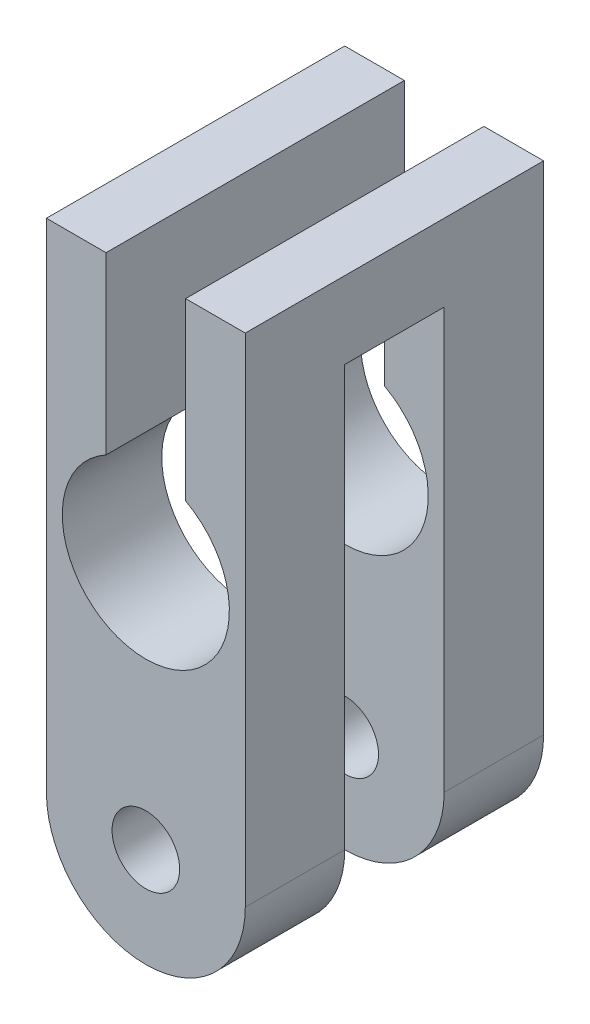
ISO-10303-21;
HEADER;
FILE_DESCRIPTION(('STEP AP214'),'2;1');
FILE_NAME('part.step','',(''),(''),'','','');
FILE_SCHEMA(('AUTOMOTIVE_DESIGN { 1 0 10303 214 1 1 1 1 }'));
ENDSEC;
DATA;
#1=APPLICATION_CONTEXT('core data for automotive mechanical design processes');
#2=APPLICATION_PROTOCOL_DEFINITION('international standard','automotive_design',2000,#1);
#3=PRODUCT_CONTEXT('',#1,'mechanical');
#4=PRODUCT('Part','Part','',(#3));
#5=PRODUCT_RELATED_PRODUCT_CATEGORY('part','',(#4));
#6=PRODUCT_DEFINITION_FORMATION('','',#4);
#7=PRODUCT_DEFINITION_CONTEXT('part definition',#1,'design');
#8=PRODUCT_DEFINITION('design','',#6,#7);
#9=PRODUCT_DEFINITION_SHAPE('','',#8);
#10=(LENGTH_UNIT() NAMED_UNIT(*) SI_UNIT(.MILLI.,.METRE.));
#11=(NAMED_UNIT(*) PLANE_ANGLE_UNIT() SI_UNIT($,.RADIAN.));
#12=(NAMED_UNIT(*) SI_UNIT($,.STERADIAN.) SOLID_ANGLE_UNIT());
#13=UNCERTAINTY_MEASURE_WITH_UNIT(LENGTH_MEASURE(1.E-05),#10,'distance_accuracy_value','');
#14=(GEOMETRIC_REPRESENTATION_CONTEXT(3) GLOBAL_UNCERTAINTY_ASSIGNED_CONTEXT((#13)) GLOBAL_UNIT_ASSIGNED_CONTEXT((#10,
#11,#12)) REPRESENTATION_CONTEXT('',''));
#15=CARTESIAN_POINT('',(0.,0.,0.));
#16=DIRECTION('',(0.,0.,1.));
#17=DIRECTION('',(1.,0.,0.));
#18=AXIS2_PLACEMENT_3D('',#15,#16,#17);
#19=CARTESIAN_POINT('',(-10.,25.,5.));
#20=DIRECTION('',(1.,0.,0.));
#21=DIRECTION('',(0.,0.,-1.));
#22=AXIS2_PLACEMENT_3D('',#19,#20,#21);
#23=PLANE('',#22);
#24=DIRECTION('',(0.,0.,1.));
#25=VECTOR('',#24,1.);
#26=CARTESIAN_POINT('',(-10.,21.,5.));
#27=LINE('',#26,#25);
#28=CARTESIAN_POINT('',(-10.,21.,5.));
#29=VERTEX_POINT('',#28);
#30=CARTESIAN_POINT('',(-10.,21.,10.));
#31=VERTEX_POINT('',#30);
#32=EDGE_CURVE('E223',#29,#31,#27,.T.);
#33=ORIENTED_EDGE('',*,*,#32,.T.);
#34=DIRECTION('',(0.,-1.,0.));
#35=VECTOR('',#34,1.);
#36=CARTESIAN_POINT('',(-10.,25.,10.));
#37=LINE('',#36,#35);
#38=CARTESIAN_POINT('',(-10.,0.,10.));
#39=VERTEX_POINT('',#38);
#40=EDGE_CURVE('E168',#31,#39,#37,.T.);
#41=ORIENTED_EDGE('',*,*,#40,.T.);
#42=DIRECTION('',(0.,0.,1.));
#43=VECTOR('',#42,1.);
#44=CARTESIAN_POINT('',(-10.,0.,10.));
#45=LINE('',#44,#43);
#46=CARTESIAN_POINT('',(-10.,0.,15.));
#47=VERTEX_POINT('',#46);
#48=EDGE_CURVE('E201',#39,#47,#45,.T.);
#49=ORIENTED_EDGE('',*,*,#48,.T.);
#50=DIRECTION('',(0.,-1.,0.));
#51=VECTOR('',#50,1.);
#52=CARTESIAN_POINT('',(-10.,21.,15.));
#53=LINE('',#52,#51);
#54=CARTESIAN_POINT('',(-10.,25.,15.));
#55=VERTEX_POINT('',#54);
#56=EDGE_CURVE('E225',#55,#47,#53,.T.);
#57=ORIENTED_EDGE('',*,*,#56,.F.);
#58=DIRECTION('',(0.,0.,-1.));
#59=VECTOR('',#58,1.);
#60=CARTESIAN_POINT('',(-10.,25.,5.));
#61=LINE('',#60,#59);
#62=CARTESIAN_POINT('',(-10.,25.,0.));
#63=VERTEX_POINT('',#62);
#64=EDGE_CURVE('E288',#55,#63,#61,.T.);
#65=ORIENTED_EDGE('',*,*,#64,.T.);
#66=DIRECTION('',(0.,-1.,0.));
#67=VECTOR('',#66,1.);
#68=CARTESIAN_POINT('',(-10.,25.,0.));
#69=LINE('',#68,#67);
#70=CARTESIAN_POINT('',(-10.,0.,0.));
#71=VERTEX_POINT('',#70);
#72=EDGE_CURVE('E264',#63,#71,#69,.T.);
#73=ORIENTED_EDGE('',*,*,#72,.T.);
#74=DIRECTION('',(0.,0.,-1.));
#75=VECTOR('',#74,1.);
#76=CARTESIAN_POINT('',(-10.,0.,5.));
#77=LINE('',#76,#75);
#78=CARTESIAN_POINT('',(-10.,0.,5.));
#79=VERTEX_POINT('',#78);
#80=EDGE_CURVE('E54',#79,#71,#77,.T.);
#81=ORIENTED_EDGE('',*,*,#80,.F.);
#82=DIRECTION('',(0.,-1.,0.));
#83=VECTOR('',#82,1.);
#84=CARTESIAN_POINT('',(-10.,25.,5.));
#85=LINE('',#84,#83);
#86=EDGE_CURVE('E268',#29,#79,#85,.T.);
#87=ORIENTED_EDGE('',*,*,#86,.F.);
#88=EDGE_LOOP('',(#33,#41,#49,#57,#65,#73,#81,#87));
#89=FACE_BOUND('',#88,.T.);
#90=ADVANCED_FACE('F45',(#89),#23,.F.);
#91=CARTESIAN_POINT('',(-5.,0.,5.));
#92=DIRECTION('',(0.,0.,-1.));
#93=DIRECTION('',(-1.,0.,0.));
#94=AXIS2_PLACEMENT_3D('',#91,#92,#93);
#95=CYLINDRICAL_SURFACE('',#94,5.);
#96=CARTESIAN_POINT('',(-5.,0.,0.));
#97=DIRECTION('',(0.,0.,1.));
#98=DIRECTION('',(1.,0.,0.));
#99=AXIS2_PLACEMENT_3D('',#96,#97,#98);
#100=CIRCLE('',#99,5.);
#101=CARTESIAN_POINT('',(0.,0.,0.));
#102=VERTEX_POINT('',#101);
#103=EDGE_CURVE('E292',#71,#102,#100,.T.);
#104=ORIENTED_EDGE('',*,*,#103,.T.);
#105=DIRECTION('',(0.,0.,-1.));
#106=VECTOR('',#105,1.);
#107=CARTESIAN_POINT('',(0.,0.,5.));
#108=LINE('',#107,#106);
#109=CARTESIAN_POINT('',(0.,0.,5.));
#110=VERTEX_POINT('',#109);
#111=EDGE_CURVE('E335',#110,#102,#108,.T.);
#112=ORIENTED_EDGE('',*,*,#111,.F.);
#113=CARTESIAN_POINT('',(-5.,0.,5.));
#114=DIRECTION('',(0.,0.,1.));
#115=DIRECTION('',(1.,0.,0.));
#116=AXIS2_PLACEMENT_3D('',#113,#114,#115);
#117=CIRCLE('',#116,5.);
#118=EDGE_CURVE('E271',#79,#110,#117,.T.);
#119=ORIENTED_EDGE('',*,*,#118,.F.);
#120=ORIENTED_EDGE('',*,*,#80,.T.);
#121=EDGE_LOOP('',(#104,#112,#119,#120));
#122=FACE_BOUND('',#121,.T.);
#123=ADVANCED_FACE('F344',(#122),#95,.T.);
#124=CARTESIAN_POINT('',(0.,0.,5.));
#125=DIRECTION('',(-1.,0.,0.));
#126=DIRECTION('',(0.,0.,1.));
#127=AXIS2_PLACEMENT_3D('',#124,#125,#126);
#128=PLANE('',#127);
#129=DIRECTION('',(0.,1.,0.));
#130=VECTOR('',#129,1.);
#131=CARTESIAN_POINT('',(0.,0.,0.));
#132=LINE('',#131,#130);
#133=CARTESIAN_POINT('',(0.,25.,0.));
#134=VERTEX_POINT('',#133);
#135=EDGE_CURVE('E295',#102,#134,#132,.T.);
#136=ORIENTED_EDGE('',*,*,#135,.T.);
#137=DIRECTION('',(0.,0.,-1.));
#138=VECTOR('',#137,1.);
#139=CARTESIAN_POINT('',(0.,25.,5.));
#140=LINE('',#139,#138);
#141=CARTESIAN_POINT('',(0.,25.,15.));
#142=VERTEX_POINT('',#141);
#143=EDGE_CURVE('E332',#142,#134,#140,.T.);
#144=ORIENTED_EDGE('',*,*,#143,.F.);
#145=DIRECTION('',(0.,1.,0.));
#146=VECTOR('',#145,1.);
#147=CARTESIAN_POINT('',(0.,21.1306998068864,15.));
#148=LINE('',#147,#146);
#149=CARTESIAN_POINT('',(0.,0.,15.));
#150=VERTEX_POINT('',#149);
#151=EDGE_CURVE('E252',#150,#142,#148,.T.);
#152=ORIENTED_EDGE('',*,*,#151,.F.);
#153=DIRECTION('',(0.,0.,1.));
#154=VECTOR('',#153,1.);
#155=CARTESIAN_POINT('',(0.,0.,10.));
#156=LINE('',#155,#154);
#157=CARTESIAN_POINT('',(0.,0.,10.));
#158=VERTEX_POINT('',#157);
#159=EDGE_CURVE('E212',#158,#150,#156,.T.);
#160=ORIENTED_EDGE('',*,*,#159,.F.);
#161=DIRECTION('',(0.,1.,0.));
#162=VECTOR('',#161,1.);
#163=CARTESIAN_POINT('',(0.,0.,10.));
#164=LINE('',#163,#162);
#165=CARTESIAN_POINT('',(0.,21.1306998068864,10.));
#166=VERTEX_POINT('',#165);
#167=EDGE_CURVE('E190',#158,#166,#164,.T.);
#168=ORIENTED_EDGE('',*,*,#167,.T.);
#169=DIRECTION('',(0.,0.,1.));
#170=VECTOR('',#169,1.);
#171=CARTESIAN_POINT('',(0.,21.1306998068864,5.));
#172=LINE('',#171,#170);
#173=CARTESIAN_POINT('',(0.,21.1306998068864,5.));
#174=VERTEX_POINT('',#173);
#175=EDGE_CURVE('E220',#174,#166,#172,.T.);
#176=ORIENTED_EDGE('',*,*,#175,.F.);
#177=DIRECTION('',(0.,1.,0.));
#178=VECTOR('',#177,1.);
#179=CARTESIAN_POINT('',(0.,0.,5.));
#180=LINE('',#179,#178);
#181=EDGE_CURVE('E275',#110,#174,#180,.T.);
#182=ORIENTED_EDGE('',*,*,#181,.F.);
#183=ORIENTED_EDGE('',*,*,#111,.T.);
#184=EDGE_LOOP('',(#136,#144,#152,#160,#168,#176,#182,#183));
#185=FACE_BOUND('',#184,.T.);
#186=ADVANCED_FACE('F355',(#185),#128,.F.);
#187=CARTESIAN_POINT('',(0.,25.,5.));
#188=DIRECTION('',(0.,-1.,0.));
#189=DIRECTION('',(0.,0.,-1.));
#190=AXIS2_PLACEMENT_3D('',#187,#188,#189);
#191=PLANE('',#190);
#192=DIRECTION('',(-1.,0.,0.));
#193=VECTOR('',#192,1.);
#194=CARTESIAN_POINT('',(0.,25.,0.));
#195=LINE('',#194,#193);
#196=CARTESIAN_POINT('',(-3.,25.,0.));
#197=VERTEX_POINT('',#196);
#198=EDGE_CURVE('E299',#134,#197,#195,.T.);
#199=ORIENTED_EDGE('',*,*,#198,.T.);
#200=DIRECTION('',(0.,0.,-1.));
#201=VECTOR('',#200,1.);
#202=CARTESIAN_POINT('',(-3.,25.,5.));
#203=LINE('',#202,#201);
#204=CARTESIAN_POINT('',(-3.,25.,15.));
#205=VERTEX_POINT('',#204);
#206=EDGE_CURVE('E329',#205,#197,#203,.T.);
#207=ORIENTED_EDGE('',*,*,#206,.F.);
#208=DIRECTION('',(-1.,0.,0.));
#209=VECTOR('',#208,1.);
#210=CARTESIAN_POINT('',(-3.,25.,15.));
#211=LINE('',#210,#209);
#212=EDGE_CURVE('E248',#142,#205,#211,.T.);
#213=ORIENTED_EDGE('',*,*,#212,.F.);
#214=ORIENTED_EDGE('',*,*,#143,.T.);
#215=EDGE_LOOP('',(#199,#207,#213,#214));
#216=FACE_BOUND('',#215,.T.);
#217=ADVANCED_FACE('F416',(#216),#191,.F.);
#218=CARTESIAN_POINT('',(-3.,16.1932370625239,5.));
#219=DIRECTION('',(-1.,0.,0.));
#220=DIRECTION('',(0.,0.,1.));
#221=AXIS2_PLACEMENT_3D('',#218,#219,#220);
#222=PLANE('',#221);
#223=DIRECTION('',(0.,0.,1.));
#224=VECTOR('',#223,1.);
#225=CARTESIAN_POINT('',(-3.,21.1306998068864,5.));
#226=LINE('',#225,#224);
#227=CARTESIAN_POINT('',(-3.,21.1306998068864,5.));
#228=VERTEX_POINT('',#227);
#229=CARTESIAN_POINT('',(-3.,21.1306998068864,10.));
#230=VERTEX_POINT('',#229);
#231=EDGE_CURVE('E241',#228,#230,#226,.T.);
#232=ORIENTED_EDGE('',*,*,#231,.T.);
#233=DIRECTION('',(0.,1.,0.));
#234=VECTOR('',#233,1.);
#235=CARTESIAN_POINT('',(-3.,16.1932370625239,10.));
#236=LINE('',#235,#234);
#237=CARTESIAN_POINT('',(-3.,16.1932370625239,10.));
#238=VERTEX_POINT('',#237);
#239=EDGE_CURVE('E187',#238,#230,#236,.T.);
#240=ORIENTED_EDGE('',*,*,#239,.F.);
#241=DIRECTION('',(0.,0.,1.));
#242=VECTOR('',#241,1.);
#243=CARTESIAN_POINT('',(-3.,16.1932370625239,10.));
#244=LINE('',#243,#242);
#245=CARTESIAN_POINT('',(-3.,16.1932370625239,15.));
#246=VERTEX_POINT('',#245);
#247=EDGE_CURVE('E181',#238,#246,#244,.T.);
#248=ORIENTED_EDGE('',*,*,#247,.T.);
#249=DIRECTION('',(0.,-1.,0.));
#250=VECTOR('',#249,1.);
#251=CARTESIAN_POINT('',(-3.,21.1306998068864,15.));
#252=LINE('',#251,#250);
#253=EDGE_CURVE('E228',#205,#246,#252,.T.);
#254=ORIENTED_EDGE('',*,*,#253,.F.);
#255=ORIENTED_EDGE('',*,*,#206,.T.);
#256=DIRECTION('',(0.,1.,0.));
#257=VECTOR('',#256,1.);
#258=CARTESIAN_POINT('',(-3.,16.1932370625239,0.));
#259=LINE('',#258,#257);
#260=CARTESIAN_POINT('',(-3.,16.1932370625239,0.));
#261=VERTEX_POINT('',#260);
#262=EDGE_CURVE('E303',#261,#197,#259,.T.);
#263=ORIENTED_EDGE('',*,*,#262,.F.);
#264=DIRECTION('',(0.,0.,-1.));
#265=VECTOR('',#264,1.);
#266=CARTESIAN_POINT('',(-3.,16.1932370625239,5.));
#267=LINE('',#266,#265);
#268=CARTESIAN_POINT('',(-3.,16.1932370625239,5.));
#269=VERTEX_POINT('',#268);
#270=EDGE_CURVE('E326',#269,#261,#267,.T.);
#271=ORIENTED_EDGE('',*,*,#270,.F.);
#272=DIRECTION('',(0.,1.,0.));
#273=VECTOR('',#272,1.);
#274=CARTESIAN_POINT('',(-3.,16.1932370625239,5.));
#275=LINE('',#274,#273);
#276=EDGE_CURVE('E278',#269,#228,#275,.T.);
#277=ORIENTED_EDGE('',*,*,#276,.T.);
#278=EDGE_LOOP('',(#232,#240,#248,#254,#255,#263,#271,#277));
#279=FACE_BOUND('',#278,.T.);
#280=ADVANCED_FACE('F370',(#279),#222,.T.);
#281=CARTESIAN_POINT('',(-5.,12.5,5.));
#282=DIRECTION('',(0.,0.,-1.));
#283=DIRECTION('',(-1.,0.,0.));
#284=AXIS2_PLACEMENT_3D('',#281,#282,#283);
#285=CYLINDRICAL_SURFACE('',#284,4.2);
#286=CARTESIAN_POINT('',(-5.,12.5,0.));
#287=DIRECTION('',(0.,0.,1.));
#288=DIRECTION('',(1.,0.,0.));
#289=AXIS2_PLACEMENT_3D('',#286,#287,#288);
#290=CIRCLE('',#289,4.2);
#291=CARTESIAN_POINT('',(-7.,16.1932370625239,0.));
#292=VERTEX_POINT('',#291);
#293=EDGE_CURVE('E307',#292,#261,#290,.T.);
#294=ORIENTED_EDGE('',*,*,#293,.F.);
#295=DIRECTION('',(0.,0.,-1.));
#296=VECTOR('',#295,1.);
#297=CARTESIAN_POINT('',(-7.,16.1932370625239,5.));
#298=LINE('',#297,#296);
#299=CARTESIAN_POINT('',(-7.,16.1932370625239,5.));
#300=VERTEX_POINT('',#299);
#301=EDGE_CURVE('E323',#300,#292,#298,.T.);
#302=ORIENTED_EDGE('',*,*,#301,.F.);
#303=CARTESIAN_POINT('',(-5.,12.5,5.));
#304=DIRECTION('',(0.,0.,1.));
#305=DIRECTION('',(1.,0.,0.));
#306=AXIS2_PLACEMENT_3D('',#303,#304,#305);
#307=CIRCLE('',#306,4.2);
#308=EDGE_CURVE('E281',#300,#269,#307,.T.);
#309=ORIENTED_EDGE('',*,*,#308,.T.);
#310=ORIENTED_EDGE('',*,*,#270,.T.);
#311=EDGE_LOOP('',(#294,#302,#309,#310));
#312=FACE_BOUND('',#311,.T.);
#313=ADVANCED_FACE('F367',(#312),#285,.F.);
#314=CARTESIAN_POINT('',(-7.,25.,5.));
#315=DIRECTION('',(1.,0.,0.));
#316=DIRECTION('',(0.,1.,0.));
#317=AXIS2_PLACEMENT_3D('',#314,#315,#316);
#318=PLANE('',#317);
#319=DIRECTION('',(0.,-1.,0.));
#320=VECTOR('',#319,1.);
#321=CARTESIAN_POINT('',(-7.,25.,0.));
#322=LINE('',#321,#320);
#323=CARTESIAN_POINT('',(-7.,25.,0.));
#324=VERTEX_POINT('',#323);
#325=EDGE_CURVE('E311',#324,#292,#322,.T.);
#326=ORIENTED_EDGE('',*,*,#325,.F.);
#327=DIRECTION('',(0.,0.,-1.));
#328=VECTOR('',#327,1.);
#329=CARTESIAN_POINT('',(-7.,25.,5.));
#330=LINE('',#329,#328);
#331=CARTESIAN_POINT('',(-7.,25.,15.));
#332=VERTEX_POINT('',#331);
#333=EDGE_CURVE('E320',#332,#324,#330,.T.);
#334=ORIENTED_EDGE('',*,*,#333,.F.);
#335=DIRECTION('',(0.,1.,0.));
#336=VECTOR('',#335,1.);
#337=CARTESIAN_POINT('',(-7.,21.,15.));
#338=LINE('',#337,#336);
#339=CARTESIAN_POINT('',(-7.,16.1932370625239,15.));
#340=VERTEX_POINT('',#339);
#341=EDGE_CURVE('E175',#340,#332,#338,.T.);
#342=ORIENTED_EDGE('',*,*,#341,.F.);
#343=DIRECTION('',(0.,0.,1.));
#344=VECTOR('',#343,1.);
#345=CARTESIAN_POINT('',(-7.,16.1932370625239,10.));
#346=LINE('',#345,#344);
#347=CARTESIAN_POINT('',(-7.,16.1932370625239,10.));
#348=VERTEX_POINT('',#347);
#349=EDGE_CURVE('E171',#348,#340,#346,.T.);
#350=ORIENTED_EDGE('',*,*,#349,.F.);
#351=DIRECTION('',(0.,-1.,0.));
#352=VECTOR('',#351,1.);
#353=CARTESIAN_POINT('',(-7.,25.,10.));
#354=LINE('',#353,#352);
#355=CARTESIAN_POINT('',(-7.,21.,10.));
#356=VERTEX_POINT('',#355);
#357=EDGE_CURVE('E157',#356,#348,#354,.T.);
#358=ORIENTED_EDGE('',*,*,#357,.F.);
#359=DIRECTION('',(0.,0.,1.));
#360=VECTOR('',#359,1.);
#361=CARTESIAN_POINT('',(-7.,21.,5.));
#362=LINE('',#361,#360);
#363=CARTESIAN_POINT('',(-7.,21.,5.));
#364=VERTEX_POINT('',#363);
#365=EDGE_CURVE('E234',#364,#356,#362,.T.);
#366=ORIENTED_EDGE('',*,*,#365,.F.);
#367=DIRECTION('',(0.,-1.,0.));
#368=VECTOR('',#367,1.);
#369=CARTESIAN_POINT('',(-7.,25.,5.));
#370=LINE('',#369,#368);
#371=EDGE_CURVE('E285',#364,#300,#370,.T.);
#372=ORIENTED_EDGE('',*,*,#371,.T.);
#373=ORIENTED_EDGE('',*,*,#301,.T.);
#374=EDGE_LOOP('',(#326,#334,#342,#350,#358,#366,#372,#373));
#375=FACE_BOUND('',#374,.T.);
#376=ADVANCED_FACE('F173',(#375),#318,.T.);
#377=CARTESIAN_POINT('',(-7.,25.,5.));
#378=DIRECTION('',(0.,-1.,0.));
#379=DIRECTION('',(0.,0.,-1.));
#380=AXIS2_PLACEMENT_3D('',#377,#378,#379);
#381=PLANE('',#380);
#382=DIRECTION('',(-1.,0.,0.));
#383=VECTOR('',#382,1.);
#384=CARTESIAN_POINT('',(-7.,25.,0.));
#385=LINE('',#384,#383);
#386=EDGE_CURVE('E272',#324,#63,#385,.T.);
#387=ORIENTED_EDGE('',*,*,#386,.T.);
#388=ORIENTED_EDGE('',*,*,#64,.F.);
#389=DIRECTION('',(-1.,0.,0.));
#390=VECTOR('',#389,1.);
#391=CARTESIAN_POINT('',(-10.,25.,15.));
#392=LINE('',#391,#390);
#393=EDGE_CURVE('E224',#332,#55,#392,.T.);
#394=ORIENTED_EDGE('',*,*,#393,.F.);
#395=ORIENTED_EDGE('',*,*,#333,.T.);
#396=EDGE_LOOP('',(#387,#388,#394,#395));
#397=FACE_BOUND('',#396,.T.);
#398=ADVANCED_FACE('F427',(#397),#381,.F.);
#399=CARTESIAN_POINT('',(-5.,0.,5.));
#400=DIRECTION('',(0.,0.,1.));
#401=DIRECTION('',(1.,0.,0.));
#402=AXIS2_PLACEMENT_3D('',#399,#400,#401);
#403=PLANE('',#402);
#404=DIRECTION('',(1.,0.,0.));
#405=VECTOR('',#404,1.);
#406=CARTESIAN_POINT('',(-10.,21.,5.));
#407=LINE('',#406,#405);
#408=EDGE_CURVE('E68',#29,#364,#407,.T.);
#409=ORIENTED_EDGE('',*,*,#408,.F.);
#410=ORIENTED_EDGE('',*,*,#86,.T.);
#411=ORIENTED_EDGE('',*,*,#118,.T.);
#412=ORIENTED_EDGE('',*,*,#181,.T.);
#413=DIRECTION('',(1.,0.,0.));
#414=VECTOR('',#413,1.);
#415=CARTESIAN_POINT('',(-3.,21.1306998068864,5.));
#416=LINE('',#415,#414);
#417=EDGE_CURVE('E61',#228,#174,#416,.T.);
#418=ORIENTED_EDGE('',*,*,#417,.F.);
#419=ORIENTED_EDGE('',*,*,#276,.F.);
#420=ORIENTED_EDGE('',*,*,#308,.F.);
#421=ORIENTED_EDGE('',*,*,#371,.F.);
#422=EDGE_LOOP('',(#409,#410,#411,#412,#418,#419,#420,#421));
#423=FACE_BOUND('',#422,.T.);
#424=CARTESIAN_POINT('',(-5.,0.,5.));
#425=DIRECTION('',(0.,0.,1.));
#426=DIRECTION('',(1.,0.,0.));
#427=AXIS2_PLACEMENT_3D('',#424,#425,#426);
#428=CIRCLE('',#427,1.7);
#429=CARTESIAN_POINT('',(-3.3,0.,5.));
#430=VERTEX_POINT('',#429);
#431=EDGE_CURVE('E237',#430,#430,#428,.T.);
#432=ORIENTED_EDGE('',*,*,#431,.F.);
#433=EDGE_LOOP('',(#432));
#434=FACE_BOUND('',#433,.T.);
#435=ADVANCED_FACE('F358',(#423,#434),#403,.T.);
#436=CARTESIAN_POINT('',(-5.,0.,0.));
#437=DIRECTION('',(0.,0.,1.));
#438=DIRECTION('',(1.,0.,0.));
#439=AXIS2_PLACEMENT_3D('',#436,#437,#438);
#440=PLANE('',#439);
#441=CARTESIAN_POINT('',(-5.,0.,0.));
#442=DIRECTION('',(0.,0.,1.));
#443=DIRECTION('',(1.,0.,0.));
#444=AXIS2_PLACEMENT_3D('',#441,#442,#443);
#445=CIRCLE('',#444,1.7);
#446=CARTESIAN_POINT('',(-3.3,0.,0.));
#447=VERTEX_POINT('',#446);
#448=EDGE_CURVE('E260',#447,#447,#445,.T.);
#449=ORIENTED_EDGE('',*,*,#448,.T.);
#450=EDGE_LOOP('',(#449));
#451=FACE_BOUND('',#450,.T.);
#452=ORIENTED_EDGE('',*,*,#72,.F.);
#453=ORIENTED_EDGE('',*,*,#386,.F.);
#454=ORIENTED_EDGE('',*,*,#325,.T.);
#455=ORIENTED_EDGE('',*,*,#293,.T.);
#456=ORIENTED_EDGE('',*,*,#262,.T.);
#457=ORIENTED_EDGE('',*,*,#198,.F.);
#458=ORIENTED_EDGE('',*,*,#135,.F.);
#459=ORIENTED_EDGE('',*,*,#103,.F.);
#460=EDGE_LOOP('',(#452,#453,#454,#455,#456,#457,#458,#459));
#461=FACE_BOUND('',#460,.T.);
#462=ADVANCED_FACE('F351',(#451,#461),#440,.F.);
#463=CARTESIAN_POINT('',(-5.,0.,0.));
#464=DIRECTION('',(0.,0.,1.));
#465=DIRECTION('',(1.,0.,0.));
#466=AXIS2_PLACEMENT_3D('',#463,#464,#465);
#467=CYLINDRICAL_SURFACE('',#466,1.7);
#468=ORIENTED_EDGE('',*,*,#448,.F.);
#469=EDGE_LOOP('',(#468));
#470=FACE_BOUND('',#469,.T.);
#471=ORIENTED_EDGE('',*,*,#431,.T.);
#472=EDGE_LOOP('',(#471));
#473=FACE_BOUND('',#472,.T.);
#474=ADVANCED_FACE('F433',(#470,#473),#467,.F.);
#475=CARTESIAN_POINT('',(-3.,21.1306998068864,5.));
#476=DIRECTION('',(0.,-1.,0.));
#477=DIRECTION('',(0.,0.,-1.));
#478=AXIS2_PLACEMENT_3D('',#475,#476,#477);
#479=PLANE('',#478);
#480=DIRECTION('',(1.,0.,0.));
#481=VECTOR('',#480,1.);
#482=CARTESIAN_POINT('',(-3.,21.1306998068864,10.));
#483=LINE('',#482,#481);
#484=EDGE_CURVE('E180',#230,#166,#483,.T.);
#485=ORIENTED_EDGE('',*,*,#484,.F.);
#486=ORIENTED_EDGE('',*,*,#231,.F.);
#487=ORIENTED_EDGE('',*,*,#417,.T.);
#488=ORIENTED_EDGE('',*,*,#175,.T.);
#489=EDGE_LOOP('',(#485,#486,#487,#488));
#490=FACE_BOUND('',#489,.T.);
#491=ADVANCED_FACE('F374',(#490),#479,.T.);
#492=CARTESIAN_POINT('',(-10.,21.,5.));
#493=DIRECTION('',(0.,-1.,0.));
#494=DIRECTION('',(0.,0.,-1.));
#495=AXIS2_PLACEMENT_3D('',#492,#493,#494);
#496=PLANE('',#495);
#497=DIRECTION('',(1.,0.,0.));
#498=VECTOR('',#497,1.);
#499=CARTESIAN_POINT('',(-10.,21.,10.));
#500=LINE('',#499,#498);
#501=EDGE_CURVE('E11',#31,#356,#500,.T.);
#502=ORIENTED_EDGE('',*,*,#501,.F.);
#503=ORIENTED_EDGE('',*,*,#32,.F.);
#504=ORIENTED_EDGE('',*,*,#408,.T.);
#505=ORIENTED_EDGE('',*,*,#365,.T.);
#506=EDGE_LOOP('',(#502,#503,#504,#505));
#507=FACE_BOUND('',#506,.T.);
#508=ADVANCED_FACE('F362',(#507),#496,.T.);
#509=CARTESIAN_POINT('',(0.,0.,15.));
#510=DIRECTION('',(0.,0.,-1.));
#511=DIRECTION('',(-1.,0.,0.));
#512=AXIS2_PLACEMENT_3D('',#509,#510,#511);
#513=PLANE('',#512);
#514=CARTESIAN_POINT('',(-5.,0.,15.));
#515=DIRECTION('',(0.,0.,1.));
#516=DIRECTION('',(1.,0.,0.));
#517=AXIS2_PLACEMENT_3D('',#514,#515,#516);
#518=CIRCLE('',#517,1.7);
#519=CARTESIAN_POINT('',(-3.3,0.,15.));
#520=VERTEX_POINT('',#519);
#521=EDGE_CURVE('E387',#520,#520,#518,.T.);
#522=ORIENTED_EDGE('',*,*,#521,.F.);
#523=EDGE_LOOP('',(#522));
#524=FACE_BOUND('',#523,.T.);
#525=ORIENTED_EDGE('',*,*,#56,.T.);
#526=CARTESIAN_POINT('',(-5.,0.,15.));
#527=DIRECTION('',(0.,0.,1.));
#528=DIRECTION('',(1.,0.,0.));
#529=AXIS2_PLACEMENT_3D('',#526,#527,#528);
#530=CIRCLE('',#529,5.);
#531=EDGE_CURVE('E205',#47,#150,#530,.T.);
#532=ORIENTED_EDGE('',*,*,#531,.T.);
#533=ORIENTED_EDGE('',*,*,#151,.T.);
#534=ORIENTED_EDGE('',*,*,#212,.T.);
#535=ORIENTED_EDGE('',*,*,#253,.T.);
#536=CARTESIAN_POINT('',(-5.,12.5,15.));
#537=DIRECTION('',(0.,0.,1.));
#538=DIRECTION('',(1.,0.,0.));
#539=AXIS2_PLACEMENT_3D('',#536,#537,#538);
#540=CIRCLE('',#539,4.2);
#541=EDGE_CURVE('E202',#340,#246,#540,.T.);
#542=ORIENTED_EDGE('',*,*,#541,.F.);
#543=ORIENTED_EDGE('',*,*,#341,.T.);
#544=ORIENTED_EDGE('',*,*,#393,.T.);
#545=EDGE_LOOP('',(#525,#532,#533,#534,#535,#542,#543,#544));
#546=FACE_BOUND('',#545,.T.);
#547=ADVANCED_FACE('F382',(#524,#546),#513,.F.);
#548=CARTESIAN_POINT('',(-5.,12.5,10.));
#549=DIRECTION('',(0.,0.,1.));
#550=DIRECTION('',(1.,0.,0.));
#551=AXIS2_PLACEMENT_3D('',#548,#549,#550);
#552=CYLINDRICAL_SURFACE('',#551,4.2);
#553=ORIENTED_EDGE('',*,*,#541,.T.);
#554=ORIENTED_EDGE('',*,*,#247,.F.);
#555=CARTESIAN_POINT('',(-5.,12.5,10.));
#556=DIRECTION('',(0.,0.,1.));
#557=DIRECTION('',(1.,0.,0.));
#558=AXIS2_PLACEMENT_3D('',#555,#556,#557);
#559=CIRCLE('',#558,4.2);
#560=EDGE_CURVE('E161',#348,#238,#559,.T.);
#561=ORIENTED_EDGE('',*,*,#560,.F.);
#562=ORIENTED_EDGE('',*,*,#349,.T.);
#563=EDGE_LOOP('',(#553,#554,#561,#562));
#564=FACE_BOUND('',#563,.T.);
#565=ADVANCED_FACE('F183',(#564),#552,.F.);
#566=CARTESIAN_POINT('',(-5.,0.,10.));
#567=DIRECTION('',(0.,0.,1.));
#568=DIRECTION('',(1.,0.,0.));
#569=AXIS2_PLACEMENT_3D('',#566,#567,#568);
#570=CYLINDRICAL_SURFACE('',#569,5.);
#571=ORIENTED_EDGE('',*,*,#531,.F.);
#572=ORIENTED_EDGE('',*,*,#48,.F.);
#573=CARTESIAN_POINT('',(-5.,0.,10.));
#574=DIRECTION('',(0.,0.,1.));
#575=DIRECTION('',(1.,0.,0.));
#576=AXIS2_PLACEMENT_3D('',#573,#574,#575);
#577=CIRCLE('',#576,5.);
#578=EDGE_CURVE('E197',#39,#158,#577,.T.);
#579=ORIENTED_EDGE('',*,*,#578,.T.);
#580=ORIENTED_EDGE('',*,*,#159,.T.);
#581=EDGE_LOOP('',(#571,#572,#579,#580));
#582=FACE_BOUND('',#581,.T.);
#583=ADVANCED_FACE('F379',(#582),#570,.T.);
#584=CARTESIAN_POINT('',(-5.,0.,10.));
#585=DIRECTION('',(0.,0.,-1.));
#586=DIRECTION('',(1.,0.,0.));
#587=AXIS2_PLACEMENT_3D('',#584,#585,#586);
#588=PLANE('',#587);
#589=CARTESIAN_POINT('',(-5.,0.,10.));
#590=DIRECTION('',(0.,0.,-1.));
#591=DIRECTION('',(-1.,0.,0.));
#592=AXIS2_PLACEMENT_3D('',#589,#590,#591);
#593=CIRCLE('',#592,1.7);
#594=CARTESIAN_POINT('',(-6.7,0.,10.));
#595=VERTEX_POINT('',#594);
#596=EDGE_CURVE('E48',#595,#595,#593,.T.);
#597=ORIENTED_EDGE('',*,*,#596,.F.);
#598=EDGE_LOOP('',(#597));
#599=FACE_BOUND('',#598,.T.);
#600=ORIENTED_EDGE('',*,*,#239,.T.);
#601=ORIENTED_EDGE('',*,*,#484,.T.);
#602=ORIENTED_EDGE('',*,*,#167,.F.);
#603=ORIENTED_EDGE('',*,*,#578,.F.);
#604=ORIENTED_EDGE('',*,*,#40,.F.);
#605=ORIENTED_EDGE('',*,*,#501,.T.);
#606=ORIENTED_EDGE('',*,*,#357,.T.);
#607=ORIENTED_EDGE('',*,*,#560,.T.);
#608=EDGE_LOOP('',(#600,#601,#602,#603,#604,#605,#606,#607));
#609=FACE_BOUND('',#608,.T.);
#610=ADVANCED_FACE('F159',(#599,#609),#588,.T.);
#611=CARTESIAN_POINT('',(-5.,0.,0.));
#612=DIRECTION('',(0.,0.,1.));
#613=DIRECTION('',(1.,0.,0.));
#614=AXIS2_PLACEMENT_3D('',#611,#612,#613);
#615=CYLINDRICAL_SURFACE('',#614,1.7);
#616=ORIENTED_EDGE('',*,*,#596,.T.);
#617=EDGE_LOOP('',(#616));
#618=FACE_BOUND('',#617,.T.);
#619=ORIENTED_EDGE('',*,*,#521,.T.);
#620=EDGE_LOOP('',(#619));
#621=FACE_BOUND('',#620,.T.);
#622=ADVANCED_FACE('F396',(#618,#621),#615,.F.);
#623=CLOSED_SHELL('',(#90,#123,#186,#217,#280,#313,#376,#398,#435,#462,#474,#491,#508,#547,#565,
#583,#610,#622));
#624=MANIFOLD_SOLID_BREP('B2',#623);
#625=ADVANCED_BREP_SHAPE_REPRESENTATION('',(#18,#624),#14);
#626=SHAPE_DEFINITION_REPRESENTATION(#9,#625);
ENDSEC;
END-ISO-10303-21;
